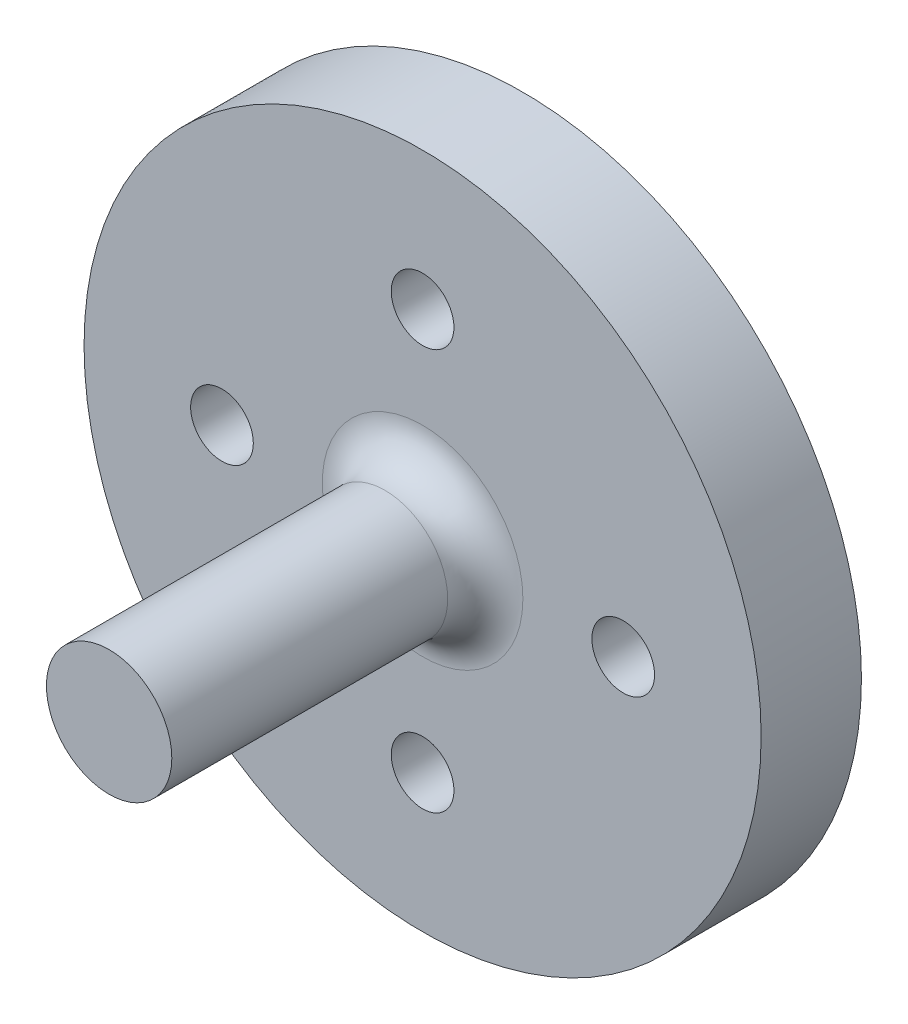
ISO-10303-21;
HEADER;
FILE_DESCRIPTION(('STEP AP214'),'2;1');
FILE_NAME('part.step','',(''),(''),'','','');
FILE_SCHEMA(('AUTOMOTIVE_DESIGN { 1 0 10303 214 1 1 1 1 }'));
ENDSEC;
DATA;
#1=APPLICATION_CONTEXT('core data for automotive mechanical design processes');
#2=APPLICATION_PROTOCOL_DEFINITION('international standard','automotive_design',2000,#1);
#3=PRODUCT_CONTEXT('',#1,'mechanical');
#4=PRODUCT('Part','Part','',(#3));
#5=PRODUCT_RELATED_PRODUCT_CATEGORY('part','',(#4));
#6=PRODUCT_DEFINITION_FORMATION('','',#4);
#7=PRODUCT_DEFINITION_CONTEXT('part definition',#1,'design');
#8=PRODUCT_DEFINITION('design','',#6,#7);
#9=PRODUCT_DEFINITION_SHAPE('','',#8);
#10=(LENGTH_UNIT() NAMED_UNIT(*) SI_UNIT(.MILLI.,.METRE.));
#11=(NAMED_UNIT(*) PLANE_ANGLE_UNIT() SI_UNIT($,.RADIAN.));
#12=(NAMED_UNIT(*) SI_UNIT($,.STERADIAN.) SOLID_ANGLE_UNIT());
#13=UNCERTAINTY_MEASURE_WITH_UNIT(LENGTH_MEASURE(1.E-05),#10,'distance_accuracy_value','');
#14=(GEOMETRIC_REPRESENTATION_CONTEXT(3) GLOBAL_UNCERTAINTY_ASSIGNED_CONTEXT((#13)) GLOBAL_UNIT_ASSIGNED_CONTEXT((#10,
#11,#12)) REPRESENTATION_CONTEXT('',''));
#15=CARTESIAN_POINT('',(0.,0.,0.));
#16=DIRECTION('',(0.,0.,1.));
#17=DIRECTION('',(1.,0.,0.));
#18=AXIS2_PLACEMENT_3D('',#15,#16,#17);
#19=CARTESIAN_POINT('',(0.,0.,8.));
#20=DIRECTION('',(0.,0.,-1.));
#21=DIRECTION('',(-1.,0.,0.));
#22=AXIS2_PLACEMENT_3D('',#19,#20,#21);
#23=CYLINDRICAL_SURFACE('',#22,27.);
#24=CARTESIAN_POINT('',(0.,0.,8.));
#25=DIRECTION('',(0.,0.,1.));
#26=DIRECTION('',(1.,0.,0.));
#27=AXIS2_PLACEMENT_3D('',#24,#25,#26);
#28=CIRCLE('',#27,27.);
#29=CARTESIAN_POINT('',(27.,0.,8.));
#30=VERTEX_POINT('',#29);
#31=EDGE_CURVE('E65',#30,#30,#28,.T.);
#32=ORIENTED_EDGE('',*,*,#31,.F.);
#33=EDGE_LOOP('',(#32));
#34=FACE_BOUND('',#33,.T.);
#35=CARTESIAN_POINT('',(0.,0.,0.));
#36=DIRECTION('',(0.,0.,1.));
#37=DIRECTION('',(1.,0.,0.));
#38=AXIS2_PLACEMENT_3D('',#35,#36,#37);
#39=CIRCLE('',#38,27.);
#40=CARTESIAN_POINT('',(27.,0.,0.));
#41=VERTEX_POINT('',#40);
#42=EDGE_CURVE('E71',#41,#41,#39,.T.);
#43=ORIENTED_EDGE('',*,*,#42,.T.);
#44=EDGE_LOOP('',(#43));
#45=FACE_BOUND('',#44,.T.);
#46=ADVANCED_FACE('F51',(#34,#45),#23,.T.);
#47=CARTESIAN_POINT('',(0.,0.,8.));
#48=DIRECTION('',(0.,0.,1.));
#49=DIRECTION('',(1.,0.,0.));
#50=AXIS2_PLACEMENT_3D('',#47,#48,#49);
#51=PLANE('',#50);
#52=CARTESIAN_POINT('',(0.,0.,8.));
#53=DIRECTION('',(0.,0.,1.));
#54=DIRECTION('',(1.,0.,0.));
#55=AXIS2_PLACEMENT_3D('',#52,#53,#54);
#56=CIRCLE('',#55,8.);
#57=CARTESIAN_POINT('',(8.,0.,8.));
#58=VERTEX_POINT('',#57);
#59=EDGE_CURVE('E10',#58,#58,#56,.F.);
#60=ORIENTED_EDGE('',*,*,#59,.T.);
#61=EDGE_LOOP('',(#60));
#62=FACE_BOUND('',#61,.T.);
#63=CARTESIAN_POINT('',(-16.,0.,8.));
#64=DIRECTION('',(0.,0.,1.));
#65=DIRECTION('',(1.,0.,0.));
#66=AXIS2_PLACEMENT_3D('',#63,#64,#65);
#67=CIRCLE('',#66,2.5);
#68=CARTESIAN_POINT('',(-13.5,0.,8.));
#69=VERTEX_POINT('',#68);
#70=EDGE_CURVE('E103',#69,#69,#67,.T.);
#71=ORIENTED_EDGE('',*,*,#70,.F.);
#72=EDGE_LOOP('',(#71));
#73=FACE_BOUND('',#72,.T.);
#74=CARTESIAN_POINT('',(0.,16.,8.));
#75=DIRECTION('',(0.,0.,1.));
#76=DIRECTION('',(1.,0.,0.));
#77=AXIS2_PLACEMENT_3D('',#74,#75,#76);
#78=CIRCLE('',#77,2.5);
#79=CARTESIAN_POINT('',(2.5,16.,8.));
#80=VERTEX_POINT('',#79);
#81=EDGE_CURVE('E99',#80,#80,#78,.T.);
#82=ORIENTED_EDGE('',*,*,#81,.F.);
#83=EDGE_LOOP('',(#82));
#84=FACE_BOUND('',#83,.T.);
#85=CARTESIAN_POINT('',(16.,0.,8.));
#86=DIRECTION('',(0.,0.,1.));
#87=DIRECTION('',(1.,0.,0.));
#88=AXIS2_PLACEMENT_3D('',#85,#86,#87);
#89=CIRCLE('',#88,2.5);
#90=CARTESIAN_POINT('',(18.5,0.,8.));
#91=VERTEX_POINT('',#90);
#92=EDGE_CURVE('E91',#91,#91,#89,.T.);
#93=ORIENTED_EDGE('',*,*,#92,.F.);
#94=EDGE_LOOP('',(#93));
#95=FACE_BOUND('',#94,.T.);
#96=CARTESIAN_POINT('',(0.,-16.,8.));
#97=DIRECTION('',(0.,0.,1.));
#98=DIRECTION('',(1.,0.,0.));
#99=AXIS2_PLACEMENT_3D('',#96,#97,#98);
#100=CIRCLE('',#99,2.5);
#101=CARTESIAN_POINT('',(2.5,-16.,8.));
#102=VERTEX_POINT('',#101);
#103=EDGE_CURVE('E82',#102,#102,#100,.T.);
#104=ORIENTED_EDGE('',*,*,#103,.F.);
#105=EDGE_LOOP('',(#104));
#106=FACE_BOUND('',#105,.T.);
#107=ORIENTED_EDGE('',*,*,#31,.T.);
#108=EDGE_LOOP('',(#107));
#109=FACE_BOUND('',#108,.T.);
#110=ADVANCED_FACE('F129',(#62,#73,#84,#95,#106,#109),#51,.T.);
#111=CARTESIAN_POINT('',(0.,0.,0.));
#112=DIRECTION('',(0.,0.,1.));
#113=DIRECTION('',(1.,0.,0.));
#114=AXIS2_PLACEMENT_3D('',#111,#112,#113);
#115=PLANE('',#114);
#116=CARTESIAN_POINT('',(-16.,0.,0.));
#117=DIRECTION('',(0.,0.,1.));
#118=DIRECTION('',(1.,0.,0.));
#119=AXIS2_PLACEMENT_3D('',#116,#117,#118);
#120=CIRCLE('',#119,2.5);
#121=CARTESIAN_POINT('',(-13.5,0.,0.));
#122=VERTEX_POINT('',#121);
#123=EDGE_CURVE('E76',#122,#122,#120,.T.);
#124=ORIENTED_EDGE('',*,*,#123,.T.);
#125=EDGE_LOOP('',(#124));
#126=FACE_BOUND('',#125,.T.);
#127=CARTESIAN_POINT('',(0.,16.,0.));
#128=DIRECTION('',(0.,0.,1.));
#129=DIRECTION('',(1.,0.,0.));
#130=AXIS2_PLACEMENT_3D('',#127,#128,#129);
#131=CIRCLE('',#130,2.5);
#132=CARTESIAN_POINT('',(2.5,16.,0.));
#133=VERTEX_POINT('',#132);
#134=EDGE_CURVE('E95',#133,#133,#131,.T.);
#135=ORIENTED_EDGE('',*,*,#134,.T.);
#136=EDGE_LOOP('',(#135));
#137=FACE_BOUND('',#136,.T.);
#138=CARTESIAN_POINT('',(16.,0.,0.));
#139=DIRECTION('',(0.,0.,1.));
#140=DIRECTION('',(1.,0.,0.));
#141=AXIS2_PLACEMENT_3D('',#138,#139,#140);
#142=CIRCLE('',#141,2.5);
#143=CARTESIAN_POINT('',(18.5,0.,0.));
#144=VERTEX_POINT('',#143);
#145=EDGE_CURVE('E87',#144,#144,#142,.T.);
#146=ORIENTED_EDGE('',*,*,#145,.T.);
#147=EDGE_LOOP('',(#146));
#148=FACE_BOUND('',#147,.T.);
#149=CARTESIAN_POINT('',(0.,-16.,0.));
#150=DIRECTION('',(0.,0.,1.));
#151=DIRECTION('',(1.,0.,0.));
#152=AXIS2_PLACEMENT_3D('',#149,#150,#151);
#153=CIRCLE('',#152,2.5);
#154=CARTESIAN_POINT('',(2.5,-16.,0.));
#155=VERTEX_POINT('',#154);
#156=EDGE_CURVE('E78',#155,#155,#153,.T.);
#157=ORIENTED_EDGE('',*,*,#156,.T.);
#158=EDGE_LOOP('',(#157));
#159=FACE_BOUND('',#158,.T.);
#160=ORIENTED_EDGE('',*,*,#42,.F.);
#161=EDGE_LOOP('',(#160));
#162=FACE_BOUND('',#161,.T.);
#163=ADVANCED_FACE('F133',(#126,#137,#148,#159,#162),#115,.F.);
#164=CARTESIAN_POINT('',(0.,-16.,0.));
#165=DIRECTION('',(0.,0.,1.));
#166=DIRECTION('',(1.,0.,0.));
#167=AXIS2_PLACEMENT_3D('',#164,#165,#166);
#168=CYLINDRICAL_SURFACE('',#167,2.5);
#169=ORIENTED_EDGE('',*,*,#156,.F.);
#170=EDGE_LOOP('',(#169));
#171=FACE_BOUND('',#170,.T.);
#172=ORIENTED_EDGE('',*,*,#103,.T.);
#173=EDGE_LOOP('',(#172));
#174=FACE_BOUND('',#173,.T.);
#175=ADVANCED_FACE('F139',(#171,#174),#168,.F.);
#176=CARTESIAN_POINT('',(16.,0.,0.));
#177=DIRECTION('',(0.,0.,1.));
#178=DIRECTION('',(1.,0.,0.));
#179=AXIS2_PLACEMENT_3D('',#176,#177,#178);
#180=CYLINDRICAL_SURFACE('',#179,2.5);
#181=ORIENTED_EDGE('',*,*,#145,.F.);
#182=EDGE_LOOP('',(#181));
#183=FACE_BOUND('',#182,.T.);
#184=ORIENTED_EDGE('',*,*,#92,.T.);
#185=EDGE_LOOP('',(#184));
#186=FACE_BOUND('',#185,.T.);
#187=ADVANCED_FACE('F144',(#183,#186),#180,.F.);
#188=CARTESIAN_POINT('',(0.,16.,0.));
#189=DIRECTION('',(0.,0.,1.));
#190=DIRECTION('',(1.,0.,0.));
#191=AXIS2_PLACEMENT_3D('',#188,#189,#190);
#192=CYLINDRICAL_SURFACE('',#191,2.5);
#193=ORIENTED_EDGE('',*,*,#134,.F.);
#194=EDGE_LOOP('',(#193));
#195=FACE_BOUND('',#194,.T.);
#196=ORIENTED_EDGE('',*,*,#81,.T.);
#197=EDGE_LOOP('',(#196));
#198=FACE_BOUND('',#197,.T.);
#199=ADVANCED_FACE('F125',(#195,#198),#192,.F.);
#200=CARTESIAN_POINT('',(-16.,0.,0.));
#201=DIRECTION('',(0.,0.,1.));
#202=DIRECTION('',(1.,0.,0.));
#203=AXIS2_PLACEMENT_3D('',#200,#201,#202);
#204=CYLINDRICAL_SURFACE('',#203,2.5);
#205=ORIENTED_EDGE('',*,*,#123,.F.);
#206=EDGE_LOOP('',(#205));
#207=FACE_BOUND('',#206,.T.);
#208=ORIENTED_EDGE('',*,*,#70,.T.);
#209=EDGE_LOOP('',(#208));
#210=FACE_BOUND('',#209,.T.);
#211=ADVANCED_FACE('F119',(#207,#210),#204,.F.);
#212=CARTESIAN_POINT('',(0.,0.,33.));
#213=DIRECTION('',(0.,0.,-1.));
#214=DIRECTION('',(-1.,0.,0.));
#215=AXIS2_PLACEMENT_3D('',#212,#213,#214);
#216=CYLINDRICAL_SURFACE('',#215,5.);
#217=CARTESIAN_POINT('',(0.,0.,11.));
#218=DIRECTION('',(0.,0.,1.));
#219=DIRECTION('',(1.,0.,0.));
#220=AXIS2_PLACEMENT_3D('',#217,#218,#219);
#221=CIRCLE('',#220,5.);
#222=CARTESIAN_POINT('',(5.,0.,11.));
#223=VERTEX_POINT('',#222);
#224=EDGE_CURVE('E59',#223,#223,#221,.T.);
#225=ORIENTED_EDGE('',*,*,#224,.T.);
#226=EDGE_LOOP('',(#225));
#227=FACE_BOUND('',#226,.T.);
#228=CARTESIAN_POINT('',(0.,0.,33.));
#229=DIRECTION('',(0.,0.,1.));
#230=DIRECTION('',(1.,0.,0.));
#231=AXIS2_PLACEMENT_3D('',#228,#229,#230);
#232=CIRCLE('',#231,5.);
#233=CARTESIAN_POINT('',(5.,0.,33.));
#234=VERTEX_POINT('',#233);
#235=EDGE_CURVE('E83',#234,#234,#232,.T.);
#236=ORIENTED_EDGE('',*,*,#235,.F.);
#237=EDGE_LOOP('',(#236));
#238=FACE_BOUND('',#237,.T.);
#239=ADVANCED_FACE('F117',(#227,#238),#216,.T.);
#240=CARTESIAN_POINT('',(0.,0.,33.));
#241=DIRECTION('',(0.,0.,1.));
#242=DIRECTION('',(1.,0.,0.));
#243=AXIS2_PLACEMENT_3D('',#240,#241,#242);
#244=PLANE('',#243);
#245=ORIENTED_EDGE('',*,*,#235,.T.);
#246=EDGE_LOOP('',(#245));
#247=FACE_BOUND('',#246,.T.);
#248=ADVANCED_FACE('F115',(#247),#244,.T.);
#249=CARTESIAN_POINT('',(0.,0.,11.));
#250=DIRECTION('',(0.,0.,1.));
#251=DIRECTION('',(1.,0.,0.));
#252=AXIS2_PLACEMENT_3D('',#249,#250,#251);
#253=TOROIDAL_SURFACE('',#252,8.,3.);
#254=ORIENTED_EDGE('',*,*,#59,.F.);
#255=EDGE_LOOP('',(#254));
#256=FACE_BOUND('',#255,.T.);
#257=ORIENTED_EDGE('',*,*,#224,.F.);
#258=EDGE_LOOP('',(#257));
#259=FACE_BOUND('',#258,.T.);
#260=ADVANCED_FACE('F53',(#256,#259),#253,.F.);
#261=CLOSED_SHELL('',(#46,#110,#163,#175,#187,#199,#211,#239,#248,#260));
#262=MANIFOLD_SOLID_BREP('B2',#261);
#263=ADVANCED_BREP_SHAPE_REPRESENTATION('',(#18,#262),#14);
#264=SHAPE_DEFINITION_REPRESENTATION(#9,#263);
ENDSEC;
END-ISO-10303-21;
